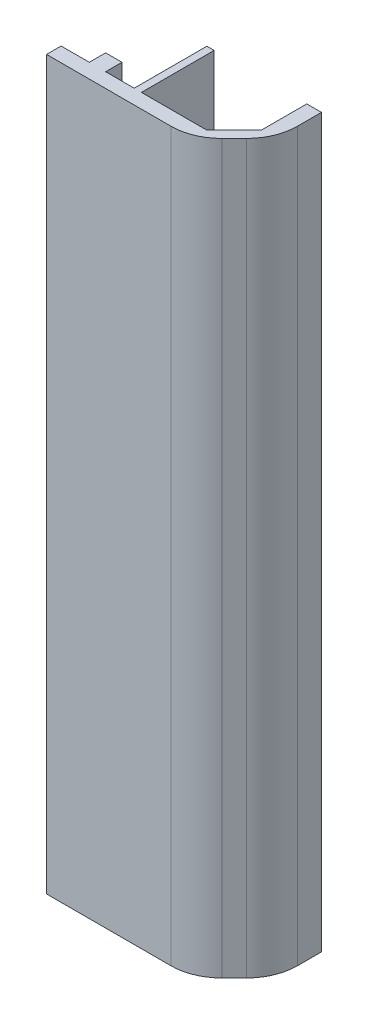
ISO-10303-21;
HEADER;
FILE_DESCRIPTION(('STEP AP214'),'2;1');
FILE_NAME('part.step','',(''),(''),'','','');
FILE_SCHEMA(('AUTOMOTIVE_DESIGN { 1 0 10303 214 1 1 1 1 }'));
ENDSEC;
DATA;
#1=APPLICATION_CONTEXT('core data for automotive mechanical design processes');
#2=APPLICATION_PROTOCOL_DEFINITION('international standard','automotive_design',2000,#1);
#3=PRODUCT_CONTEXT('',#1,'mechanical');
#4=PRODUCT('Part','Part','',(#3));
#5=PRODUCT_RELATED_PRODUCT_CATEGORY('part','',(#4));
#6=PRODUCT_DEFINITION_FORMATION('','',#4);
#7=PRODUCT_DEFINITION_CONTEXT('part definition',#1,'design');
#8=PRODUCT_DEFINITION('design','',#6,#7);
#9=PRODUCT_DEFINITION_SHAPE('','',#8);
#10=(LENGTH_UNIT() NAMED_UNIT(*) SI_UNIT(.MILLI.,.METRE.));
#11=(NAMED_UNIT(*) PLANE_ANGLE_UNIT() SI_UNIT($,.RADIAN.));
#12=(NAMED_UNIT(*) SI_UNIT($,.STERADIAN.) SOLID_ANGLE_UNIT());
#13=UNCERTAINTY_MEASURE_WITH_UNIT(LENGTH_MEASURE(1.E-05),#10,'distance_accuracy_value','');
#14=(GEOMETRIC_REPRESENTATION_CONTEXT(3) GLOBAL_UNCERTAINTY_ASSIGNED_CONTEXT((#13)) GLOBAL_UNIT_ASSIGNED_CONTEXT((#10,
#11,#12)) REPRESENTATION_CONTEXT('',''));
#15=CARTESIAN_POINT('',(0.,0.,0.));
#16=DIRECTION('',(0.,0.,1.));
#17=DIRECTION('',(1.,0.,0.));
#18=AXIS2_PLACEMENT_3D('',#15,#16,#17);
#19=CARTESIAN_POINT('',(-23.0017231924407,200.,-2.35925925925926));
#20=DIRECTION('',(0.,0.,1.));
#21=DIRECTION('',(1.,0.,0.));
#22=AXIS2_PLACEMENT_3D('',#19,#20,#21);
#23=PLANE('',#22);
#24=DIRECTION('',(0.,-1.,0.));
#25=VECTOR('',#24,1.);
#26=CARTESIAN_POINT('',(-13.1517231924407,200.,-2.35925925925926));
#27=LINE('',#26,#25);
#28=CARTESIAN_POINT('',(-13.1517231924407,200.,-2.35925925925926));
#29=VERTEX_POINT('',#28);
#30=CARTESIAN_POINT('',(-13.1517231924407,0.,-2.35925925925926));
#31=VERTEX_POINT('',#30);
#32=EDGE_CURVE('E59',#29,#31,#27,.T.);
#33=ORIENTED_EDGE('',*,*,#32,.F.);
#34=DIRECTION('',(-1.,0.,0.));
#35=VECTOR('',#34,1.);
#36=CARTESIAN_POINT('',(-23.0017231924407,200.,-2.35925925925926));
#37=LINE('',#36,#35);
#38=CARTESIAN_POINT('',(4.74827680755932,200.,-2.35925925925926));
#39=VERTEX_POINT('',#38);
#40=EDGE_CURVE('E218',#39,#29,#37,.T.);
#41=ORIENTED_EDGE('',*,*,#40,.F.);
#42=DIRECTION('',(0.,-1.,0.));
#43=VECTOR('',#42,1.);
#44=CARTESIAN_POINT('',(4.74827680755932,200.,-2.35925925925926));
#45=LINE('',#44,#43);
#46=CARTESIAN_POINT('',(4.74827680755932,0.,-2.35925925925926));
#47=VERTEX_POINT('',#46);
#48=EDGE_CURVE('E256',#39,#47,#45,.T.);
#49=ORIENTED_EDGE('',*,*,#48,.T.);
#50=DIRECTION('',(-1.,0.,0.));
#51=VECTOR('',#50,1.);
#52=CARTESIAN_POINT('',(-23.0017231924407,0.,-2.35925925925926));
#53=LINE('',#52,#51);
#54=EDGE_CURVE('E243',#47,#31,#53,.T.);
#55=ORIENTED_EDGE('',*,*,#54,.T.);
#56=EDGE_LOOP('',(#33,#41,#49,#55));
#57=FACE_BOUND('',#56,.T.);
#58=ADVANCED_FACE('F36',(#57),#23,.F.);
#59=DIRECTION('',(0.,1.,0.));
#60=VECTOR('',#59,1.);
#61=CARTESIAN_POINT('',(-15.1517231924407,200.,-2.35925925925926));
#62=LINE('',#61,#60);
#63=CARTESIAN_POINT('',(-15.1517231924407,0.,-2.35925925925926));
#64=VERTEX_POINT('',#63);
#65=CARTESIAN_POINT('',(-15.1517231924407,200.,-2.35925925925926));
#66=VERTEX_POINT('',#65);
#67=EDGE_CURVE('E184',#64,#66,#62,.T.);
#68=ORIENTED_EDGE('',*,*,#67,.F.);
#69=CARTESIAN_POINT('',(-23.0017231924407,0.,-2.35925925925926));
#70=VERTEX_POINT('',#69);
#71=EDGE_CURVE('E242',#64,#70,#53,.T.);
#72=ORIENTED_EDGE('',*,*,#71,.T.);
#73=DIRECTION('',(0.,-1.,0.));
#74=VECTOR('',#73,1.);
#75=CARTESIAN_POINT('',(-23.0017231924407,200.,-2.35925925925926));
#76=LINE('',#75,#74);
#77=CARTESIAN_POINT('',(-23.0017231924407,200.,-2.35925925925926));
#78=VERTEX_POINT('',#77);
#79=EDGE_CURVE('E253',#78,#70,#76,.T.);
#80=ORIENTED_EDGE('',*,*,#79,.F.);
#81=EDGE_CURVE('E51',#66,#78,#37,.T.);
#82=ORIENTED_EDGE('',*,*,#81,.F.);
#83=EDGE_LOOP('',(#68,#72,#80,#82));
#84=FACE_BOUND('',#83,.T.);
#85=ADVANCED_FACE('F328',(#84),#23,.F.);
#86=CARTESIAN_POINT('',(-27.5017231924407,200.,-6.85925925925926));
#87=DIRECTION('',(1.,0.,0.));
#88=DIRECTION('',(0.,0.,-1.));
#89=AXIS2_PLACEMENT_3D('',#86,#87,#88);
#90=PLANE('',#89);
#91=DIRECTION('',(0.,0.,1.));
#92=VECTOR('',#91,1.);
#93=CARTESIAN_POINT('',(-27.5017231924407,0.,-6.85925925925926));
#94=LINE('',#93,#92);
#95=CARTESIAN_POINT('',(-27.5017231924407,0.,-6.85925925925926));
#96=VERTEX_POINT('',#95);
#97=CARTESIAN_POINT('',(-27.5017231924407,0.,-2.35925925925926));
#98=VERTEX_POINT('',#97);
#99=EDGE_CURVE('E187',#96,#98,#94,.T.);
#100=ORIENTED_EDGE('',*,*,#99,.T.);
#101=DIRECTION('',(0.,-1.,0.));
#102=VECTOR('',#101,1.);
#103=CARTESIAN_POINT('',(-27.5017231924407,200.,-2.35925925925926));
#104=LINE('',#103,#102);
#105=CARTESIAN_POINT('',(-27.5017231924407,200.,-2.35925925925926));
#106=VERTEX_POINT('',#105);
#107=EDGE_CURVE('E274',#106,#98,#104,.T.);
#108=ORIENTED_EDGE('',*,*,#107,.F.);
#109=DIRECTION('',(0.,0.,1.));
#110=VECTOR('',#109,1.);
#111=CARTESIAN_POINT('',(-27.5017231924407,200.,-6.85925925925926));
#112=LINE('',#111,#110);
#113=CARTESIAN_POINT('',(-27.5017231924407,200.,-6.85925925925926));
#114=VERTEX_POINT('',#113);
#115=EDGE_CURVE('E196',#114,#106,#112,.T.);
#116=ORIENTED_EDGE('',*,*,#115,.F.);
#117=DIRECTION('',(0.,-1.,0.));
#118=VECTOR('',#117,1.);
#119=CARTESIAN_POINT('',(-27.5017231924407,200.,-6.85925925925926));
#120=LINE('',#119,#118);
#121=EDGE_CURVE('E223',#114,#96,#120,.T.);
#122=ORIENTED_EDGE('',*,*,#121,.T.);
#123=EDGE_LOOP('',(#100,#108,#116,#122));
#124=FACE_BOUND('',#123,.T.);
#125=ADVANCED_FACE('F318',(#124),#90,.F.);
#126=CARTESIAN_POINT('',(-27.5017231924407,200.,-2.35925925925926));
#127=DIRECTION('',(0.,0.,1.));
#128=DIRECTION('',(1.,0.,0.));
#129=AXIS2_PLACEMENT_3D('',#126,#127,#128);
#130=PLANE('',#129);
#131=DIRECTION('',(-1.,0.,0.));
#132=VECTOR('',#131,1.);
#133=CARTESIAN_POINT('',(-27.5017231924407,0.,-2.35925925925926));
#134=LINE('',#133,#132);
#135=CARTESIAN_POINT('',(-35.2517231924407,0.,-2.35925925925926));
#136=VERTEX_POINT('',#135);
#137=EDGE_CURVE('E190',#98,#136,#134,.T.);
#138=ORIENTED_EDGE('',*,*,#137,.T.);
#139=DIRECTION('',(0.,-1.,0.));
#140=VECTOR('',#139,1.);
#141=CARTESIAN_POINT('',(-35.2517231924407,200.,-2.35925925925926));
#142=LINE('',#141,#140);
#143=CARTESIAN_POINT('',(-35.2517231924407,200.,-2.35925925925926));
#144=VERTEX_POINT('',#143);
#145=EDGE_CURVE('E271',#144,#136,#142,.T.);
#146=ORIENTED_EDGE('',*,*,#145,.F.);
#147=DIRECTION('',(-1.,0.,0.));
#148=VECTOR('',#147,1.);
#149=CARTESIAN_POINT('',(-27.5017231924407,200.,-2.35925925925926));
#150=LINE('',#149,#148);
#151=EDGE_CURVE('E199',#106,#144,#150,.T.);
#152=ORIENTED_EDGE('',*,*,#151,.F.);
#153=ORIENTED_EDGE('',*,*,#107,.T.);
#154=EDGE_LOOP('',(#138,#146,#152,#153));
#155=FACE_BOUND('',#154,.T.);
#156=ADVANCED_FACE('F315',(#155),#130,.F.);
#157=CARTESIAN_POINT('',(-35.2517231924407,200.,-2.35925925925926));
#158=DIRECTION('',(1.,0.,0.));
#159=DIRECTION('',(0.,0.,-1.));
#160=AXIS2_PLACEMENT_3D('',#157,#158,#159);
#161=PLANE('',#160);
#162=DIRECTION('',(0.,0.,1.));
#163=VECTOR('',#162,1.);
#164=CARTESIAN_POINT('',(-35.2517231924407,0.,-2.35925925925926));
#165=LINE('',#164,#163);
#166=CARTESIAN_POINT('',(-35.2517231924407,0.,1.64074074074074));
#167=VERTEX_POINT('',#166);
#168=EDGE_CURVE('E226',#136,#167,#165,.T.);
#169=ORIENTED_EDGE('',*,*,#168,.T.);
#170=DIRECTION('',(0.,-1.,0.));
#171=VECTOR('',#170,1.);
#172=CARTESIAN_POINT('',(-35.2517231924407,200.,1.64074074074074));
#173=LINE('',#172,#171);
#174=CARTESIAN_POINT('',(-35.2517231924407,200.,1.64074074074074));
#175=VERTEX_POINT('',#174);
#176=EDGE_CURVE('E268',#175,#167,#173,.T.);
#177=ORIENTED_EDGE('',*,*,#176,.F.);
#178=DIRECTION('',(0.,0.,1.));
#179=VECTOR('',#178,1.);
#180=CARTESIAN_POINT('',(-35.2517231924407,200.,-2.35925925925926));
#181=LINE('',#180,#179);
#182=EDGE_CURVE('E202',#144,#175,#181,.T.);
#183=ORIENTED_EDGE('',*,*,#182,.F.);
#184=ORIENTED_EDGE('',*,*,#145,.T.);
#185=EDGE_LOOP('',(#169,#177,#183,#184));
#186=FACE_BOUND('',#185,.T.);
#187=ADVANCED_FACE('F309',(#186),#161,.F.);
#188=CARTESIAN_POINT('',(-35.2517231924407,200.,1.64074074074074));
#189=DIRECTION('',(0.,0.,-1.));
#190=DIRECTION('',(-1.,0.,0.));
#191=AXIS2_PLACEMENT_3D('',#188,#189,#190);
#192=PLANE('',#191);
#193=DIRECTION('',(1.,0.,0.));
#194=VECTOR('',#193,1.);
#195=CARTESIAN_POINT('',(-35.2517231924407,0.,1.64074074074074));
#196=LINE('',#195,#194);
#197=CARTESIAN_POINT('',(-1.02071306566402,0.,1.64074074074074));
#198=VERTEX_POINT('',#197);
#199=EDGE_CURVE('E228',#167,#198,#196,.T.);
#200=ORIENTED_EDGE('',*,*,#199,.T.);
#201=DIRECTION('',(0.,-1.,0.));
#202=VECTOR('',#201,1.);
#203=CARTESIAN_POINT('',(-1.02071306566402,200.,1.64074074074074));
#204=LINE('',#203,#202);
#205=CARTESIAN_POINT('',(-1.02071306566402,200.,1.64074074074074));
#206=VERTEX_POINT('',#205);
#207=EDGE_CURVE('E286',#198,#206,#204,.F.);
#208=ORIENTED_EDGE('',*,*,#207,.T.);
#209=DIRECTION('',(1.,0.,0.));
#210=VECTOR('',#209,1.);
#211=CARTESIAN_POINT('',(-35.2517231924407,200.,1.64074074074074));
#212=LINE('',#211,#210);
#213=EDGE_CURVE('E204',#175,#206,#212,.T.);
#214=ORIENTED_EDGE('',*,*,#213,.F.);
#215=ORIENTED_EDGE('',*,*,#176,.T.);
#216=EDGE_LOOP('',(#200,#208,#214,#215));
#217=FACE_BOUND('',#216,.T.);
#218=ADVANCED_FACE('F305',(#217),#192,.F.);
#219=CARTESIAN_POINT('',(4.77827680755932,200.,1.64074074074074));
#220=DIRECTION('',(-0.707106781186547,0.,-0.707106781186548));
#221=DIRECTION('',(-0.707106781186548,0.,0.707106781186547));
#222=AXIS2_PLACEMENT_3D('',#219,#220,#221);
#223=PLANE('',#222);
#224=DIRECTION('',(0.707106781186548,0.,-0.707106781186547));
#225=VECTOR('',#224,1.);
#226=CARTESIAN_POINT('',(4.77827680755932,200.,1.64074074074074));
#227=LINE('',#226,#225);
#228=CARTESIAN_POINT('',(8.87878187094765,200.,-2.45976432264759));
#229=VERTEX_POINT('',#228);
#230=CARTESIAN_POINT('',(12.2611050775043,200.,-5.84208752920422));
#231=VERTEX_POINT('',#230);
#232=EDGE_CURVE('E207',#229,#231,#227,.T.);
#233=ORIENTED_EDGE('',*,*,#232,.F.);
#234=DIRECTION('',(0.,-1.,0.));
#235=VECTOR('',#234,1.);
#236=CARTESIAN_POINT('',(8.87878187094765,200.,-2.45976432264759));
#237=LINE('',#236,#235);
#238=CARTESIAN_POINT('',(8.87878187094765,0.,-2.45976432264759));
#239=VERTEX_POINT('',#238);
#240=EDGE_CURVE('E279',#229,#239,#237,.T.);
#241=ORIENTED_EDGE('',*,*,#240,.T.);
#242=DIRECTION('',(0.707106781186548,0.,-0.707106781186547));
#243=VECTOR('',#242,1.);
#244=CARTESIAN_POINT('',(4.77827680755932,0.,1.64074074074074));
#245=LINE('',#244,#243);
#246=CARTESIAN_POINT('',(12.2611050775043,0.,-5.84208752920422));
#247=VERTEX_POINT('',#246);
#248=EDGE_CURVE('E231',#239,#247,#245,.T.);
#249=ORIENTED_EDGE('',*,*,#248,.T.);
#250=DIRECTION('',(0.,-1.,0.));
#251=VECTOR('',#250,1.);
#252=CARTESIAN_POINT('',(12.2611050775043,200.,-5.84208752920422));
#253=LINE('',#252,#251);
#254=EDGE_CURVE('E277',#247,#231,#253,.F.);
#255=ORIENTED_EDGE('',*,*,#254,.T.);
#256=EDGE_LOOP('',(#233,#241,#249,#255));
#257=FACE_BOUND('',#256,.T.);
#258=ADVANCED_FACE('F299',(#257),#223,.F.);
#259=CARTESIAN_POINT('',(16.3616101408926,200.,-22.3592592592593));
#260=DIRECTION('',(-1.,0.,0.));
#261=DIRECTION('',(0.,0.,1.));
#262=AXIS2_PLACEMENT_3D('',#259,#260,#261);
#263=PLANE('',#262);
#264=DIRECTION('',(0.,0.,-1.));
#265=VECTOR('',#264,1.);
#266=CARTESIAN_POINT('',(16.3616101408926,200.,-22.3592592592593));
#267=LINE('',#266,#265);
#268=CARTESIAN_POINT('',(16.3616101408926,200.,-15.7415824658159));
#269=VERTEX_POINT('',#268);
#270=CARTESIAN_POINT('',(16.3616101408926,200.,-22.3592592592593));
#271=VERTEX_POINT('',#270);
#272=EDGE_CURVE('E210',#269,#271,#267,.T.);
#273=ORIENTED_EDGE('',*,*,#272,.F.);
#274=DIRECTION('',(0.,-1.,0.));
#275=VECTOR('',#274,1.);
#276=CARTESIAN_POINT('',(16.3616101408926,200.,-15.7415824658159));
#277=LINE('',#276,#275);
#278=CARTESIAN_POINT('',(16.3616101408926,0.,-15.7415824658159));
#279=VERTEX_POINT('',#278);
#280=EDGE_CURVE('E11',#269,#279,#277,.T.);
#281=ORIENTED_EDGE('',*,*,#280,.T.);
#282=DIRECTION('',(0.,0.,-1.));
#283=VECTOR('',#282,1.);
#284=CARTESIAN_POINT('',(16.3616101408926,0.,-22.3592592592593));
#285=LINE('',#284,#283);
#286=CARTESIAN_POINT('',(16.3616101408926,0.,-22.3592592592593));
#287=VERTEX_POINT('',#286);
#288=EDGE_CURVE('E234',#279,#287,#285,.T.);
#289=ORIENTED_EDGE('',*,*,#288,.T.);
#290=DIRECTION('',(0.,-1.,0.));
#291=VECTOR('',#290,1.);
#292=CARTESIAN_POINT('',(16.3616101408926,200.,-22.3592592592593));
#293=LINE('',#292,#291);
#294=EDGE_CURVE('E265',#271,#287,#293,.T.);
#295=ORIENTED_EDGE('',*,*,#294,.F.);
#296=EDGE_LOOP('',(#273,#281,#289,#295));
#297=FACE_BOUND('',#296,.T.);
#298=ADVANCED_FACE('F358',(#297),#263,.F.);
#299=CARTESIAN_POINT('',(12.3316101408926,200.,-22.3592592592593));
#300=DIRECTION('',(0.,0.,1.));
#301=DIRECTION('',(1.,0.,0.));
#302=AXIS2_PLACEMENT_3D('',#299,#300,#301);
#303=PLANE('',#302);
#304=DIRECTION('',(-1.,0.,0.));
#305=VECTOR('',#304,1.);
#306=CARTESIAN_POINT('',(12.3316101408926,0.,-22.3592592592593));
#307=LINE('',#306,#305);
#308=CARTESIAN_POINT('',(12.3316101408926,0.,-22.3592592592593));
#309=VERTEX_POINT('',#308);
#310=EDGE_CURVE('E236',#287,#309,#307,.T.);
#311=ORIENTED_EDGE('',*,*,#310,.T.);
#312=DIRECTION('',(0.,-1.,0.));
#313=VECTOR('',#312,1.);
#314=CARTESIAN_POINT('',(12.3316101408926,200.,-22.3592592592593));
#315=LINE('',#314,#313);
#316=CARTESIAN_POINT('',(12.3316101408926,200.,-22.3592592592593));
#317=VERTEX_POINT('',#316);
#318=EDGE_CURVE('E262',#317,#309,#315,.T.);
#319=ORIENTED_EDGE('',*,*,#318,.F.);
#320=DIRECTION('',(-1.,0.,0.));
#321=VECTOR('',#320,1.);
#322=CARTESIAN_POINT('',(12.3316101408926,200.,-22.3592592592593));
#323=LINE('',#322,#321);
#324=EDGE_CURVE('E212',#271,#317,#323,.T.);
#325=ORIENTED_EDGE('',*,*,#324,.F.);
#326=ORIENTED_EDGE('',*,*,#294,.T.);
#327=EDGE_LOOP('',(#311,#319,#325,#326));
#328=FACE_BOUND('',#327,.T.);
#329=ADVANCED_FACE('F353',(#328),#303,.F.);
#330=CARTESIAN_POINT('',(12.3316101408926,200.,-9.94259259259255));
#331=DIRECTION('',(1.,0.,0.));
#332=DIRECTION('',(0.,0.,-1.));
#333=AXIS2_PLACEMENT_3D('',#330,#331,#332);
#334=PLANE('',#333);
#335=DIRECTION('',(0.,0.,1.));
#336=VECTOR('',#335,1.);
#337=CARTESIAN_POINT('',(12.3316101408926,0.,-9.94259259259255));
#338=LINE('',#337,#336);
#339=CARTESIAN_POINT('',(12.3316101408926,0.,-9.94259259259255));
#340=VERTEX_POINT('',#339);
#341=EDGE_CURVE('E238',#309,#340,#338,.T.);
#342=ORIENTED_EDGE('',*,*,#341,.T.);
#343=DIRECTION('',(0.,-1.,0.));
#344=VECTOR('',#343,1.);
#345=CARTESIAN_POINT('',(12.3316101408926,200.,-9.94259259259255));
#346=LINE('',#345,#344);
#347=CARTESIAN_POINT('',(12.3316101408926,200.,-9.94259259259255));
#348=VERTEX_POINT('',#347);
#349=EDGE_CURVE('E259',#348,#340,#346,.T.);
#350=ORIENTED_EDGE('',*,*,#349,.F.);
#351=DIRECTION('',(0.,0.,1.));
#352=VECTOR('',#351,1.);
#353=CARTESIAN_POINT('',(12.3316101408926,200.,-9.94259259259255));
#354=LINE('',#353,#352);
#355=EDGE_CURVE('E214',#317,#348,#354,.T.);
#356=ORIENTED_EDGE('',*,*,#355,.F.);
#357=ORIENTED_EDGE('',*,*,#318,.T.);
#358=EDGE_LOOP('',(#342,#350,#356,#357));
#359=FACE_BOUND('',#358,.T.);
#360=ADVANCED_FACE('F349',(#359),#334,.F.);
#361=CARTESIAN_POINT('',(4.74827680755932,200.,-2.35925925925926));
#362=DIRECTION('',(0.707106781186548,0.,0.707106781186547));
#363=DIRECTION('',(0.707106781186547,0.,-0.707106781186548));
#364=AXIS2_PLACEMENT_3D('',#361,#362,#363);
#365=PLANE('',#364);
#366=DIRECTION('',(-0.707106781186547,0.,0.707106781186548));
#367=VECTOR('',#366,1.);
#368=CARTESIAN_POINT('',(4.74827680755932,0.,-2.35925925925926));
#369=LINE('',#368,#367);
#370=EDGE_CURVE('E240',#340,#47,#369,.T.);
#371=ORIENTED_EDGE('',*,*,#370,.T.);
#372=ORIENTED_EDGE('',*,*,#48,.F.);
#373=DIRECTION('',(-0.707106781186547,0.,0.707106781186548));
#374=VECTOR('',#373,1.);
#375=CARTESIAN_POINT('',(4.74827680755932,200.,-2.35925925925926));
#376=LINE('',#375,#374);
#377=EDGE_CURVE('E216',#348,#39,#376,.T.);
#378=ORIENTED_EDGE('',*,*,#377,.F.);
#379=ORIENTED_EDGE('',*,*,#349,.T.);
#380=EDGE_LOOP('',(#371,#372,#378,#379));
#381=FACE_BOUND('',#380,.T.);
#382=ADVANCED_FACE('F345',(#381),#365,.F.);
#383=CARTESIAN_POINT('',(-23.0017231924407,200.,-6.85925925925926));
#384=DIRECTION('',(-1.,0.,0.));
#385=DIRECTION('',(0.,0.,1.));
#386=AXIS2_PLACEMENT_3D('',#383,#384,#385);
#387=PLANE('',#386);
#388=DIRECTION('',(0.,0.,-1.));
#389=VECTOR('',#388,1.);
#390=CARTESIAN_POINT('',(-23.0017231924407,0.,-6.85925925925926));
#391=LINE('',#390,#389);
#392=CARTESIAN_POINT('',(-23.0017231924407,0.,-6.85925925925926));
#393=VERTEX_POINT('',#392);
#394=EDGE_CURVE('E245',#70,#393,#391,.T.);
#395=ORIENTED_EDGE('',*,*,#394,.T.);
#396=DIRECTION('',(0.,-1.,0.));
#397=VECTOR('',#396,1.);
#398=CARTESIAN_POINT('',(-23.0017231924407,200.,-6.85925925925926));
#399=LINE('',#398,#397);
#400=CARTESIAN_POINT('',(-23.0017231924407,200.,-6.85925925925926));
#401=VERTEX_POINT('',#400);
#402=EDGE_CURVE('E250',#401,#393,#399,.T.);
#403=ORIENTED_EDGE('',*,*,#402,.F.);
#404=DIRECTION('',(0.,0.,-1.));
#405=VECTOR('',#404,1.);
#406=CARTESIAN_POINT('',(-23.0017231924407,200.,-6.85925925925926));
#407=LINE('',#406,#405);
#408=EDGE_CURVE('E220',#78,#401,#407,.T.);
#409=ORIENTED_EDGE('',*,*,#408,.F.);
#410=ORIENTED_EDGE('',*,*,#79,.T.);
#411=EDGE_LOOP('',(#395,#403,#409,#410));
#412=FACE_BOUND('',#411,.T.);
#413=ADVANCED_FACE('F326',(#412),#387,.F.);
#414=CARTESIAN_POINT('',(-27.5017231924407,200.,-6.85925925925926));
#415=DIRECTION('',(0.,0.,1.));
#416=DIRECTION('',(1.,0.,0.));
#417=AXIS2_PLACEMENT_3D('',#414,#415,#416);
#418=PLANE('',#417);
#419=DIRECTION('',(-1.,0.,0.));
#420=VECTOR('',#419,1.);
#421=CARTESIAN_POINT('',(-27.5017231924407,0.,-6.85925925925926));
#422=LINE('',#421,#420);
#423=EDGE_CURVE('E200',#393,#96,#422,.T.);
#424=ORIENTED_EDGE('',*,*,#423,.T.);
#425=ORIENTED_EDGE('',*,*,#121,.F.);
#426=DIRECTION('',(-1.,0.,0.));
#427=VECTOR('',#426,1.);
#428=CARTESIAN_POINT('',(-27.5017231924407,200.,-6.85925925925926));
#429=LINE('',#428,#427);
#430=EDGE_CURVE('E222',#401,#114,#429,.T.);
#431=ORIENTED_EDGE('',*,*,#430,.F.);
#432=ORIENTED_EDGE('',*,*,#402,.T.);
#433=EDGE_LOOP('',(#424,#425,#431,#432));
#434=FACE_BOUND('',#433,.T.);
#435=ADVANCED_FACE('F322',(#434),#418,.F.);
#436=CARTESIAN_POINT('',(0.,200.,0.));
#437=DIRECTION('',(0.,-1.,0.));
#438=DIRECTION('',(0.,0.,-1.));
#439=AXIS2_PLACEMENT_3D('',#436,#437,#438);
#440=PLANE('',#439);
#441=ORIENTED_EDGE('',*,*,#213,.T.);
#442=CARTESIAN_POINT('',(-1.02071306566402,200.,-12.3592592592593));
#443=DIRECTION('',(0.,-1.,0.));
#444=DIRECTION('',(0.,0.,-1.));
#445=AXIS2_PLACEMENT_3D('',#442,#443,#444);
#446=CIRCLE('',#445,14.);
#447=EDGE_CURVE('E44',#206,#229,#446,.F.);
#448=ORIENTED_EDGE('',*,*,#447,.T.);
#449=ORIENTED_EDGE('',*,*,#232,.T.);
#450=CARTESIAN_POINT('',(2.36161014089262,200.,-15.7415824658159));
#451=DIRECTION('',(0.,-1.,0.));
#452=DIRECTION('',(0.,0.,-1.));
#453=AXIS2_PLACEMENT_3D('',#450,#451,#452);
#454=CIRCLE('',#453,14.);
#455=EDGE_CURVE('E288',#231,#269,#454,.F.);
#456=ORIENTED_EDGE('',*,*,#455,.T.);
#457=ORIENTED_EDGE('',*,*,#272,.T.);
#458=ORIENTED_EDGE('',*,*,#324,.T.);
#459=ORIENTED_EDGE('',*,*,#355,.T.);
#460=ORIENTED_EDGE('',*,*,#377,.T.);
#461=ORIENTED_EDGE('',*,*,#40,.T.);
#462=DIRECTION('',(0.,0.,1.));
#463=VECTOR('',#462,1.);
#464=CARTESIAN_POINT('',(-13.1517231924407,200.,-22.3592592592593));
#465=LINE('',#464,#463);
#466=CARTESIAN_POINT('',(-13.1517231924407,200.,-22.3592592592593));
#467=VERTEX_POINT('',#466);
#468=EDGE_CURVE('E335',#467,#29,#465,.T.);
#469=ORIENTED_EDGE('',*,*,#468,.F.);
#470=DIRECTION('',(1.,0.,0.));
#471=VECTOR('',#470,1.);
#472=CARTESIAN_POINT('',(-13.1517231924407,200.,-22.3592592592593));
#473=LINE('',#472,#471);
#474=CARTESIAN_POINT('',(-15.1517231924407,200.,-22.3592592592593));
#475=VERTEX_POINT('',#474);
#476=EDGE_CURVE('E180',#475,#467,#473,.T.);
#477=ORIENTED_EDGE('',*,*,#476,.F.);
#478=DIRECTION('',(0.,0.,1.));
#479=VECTOR('',#478,1.);
#480=CARTESIAN_POINT('',(-15.1517231924407,200.,-22.3592592592593));
#481=LINE('',#480,#479);
#482=EDGE_CURVE('E192',#475,#66,#481,.T.);
#483=ORIENTED_EDGE('',*,*,#482,.T.);
#484=ORIENTED_EDGE('',*,*,#81,.T.);
#485=ORIENTED_EDGE('',*,*,#408,.T.);
#486=ORIENTED_EDGE('',*,*,#430,.T.);
#487=ORIENTED_EDGE('',*,*,#115,.T.);
#488=ORIENTED_EDGE('',*,*,#151,.T.);
#489=ORIENTED_EDGE('',*,*,#182,.T.);
#490=EDGE_LOOP('',(#441,#448,#449,#456,#457,#458,#459,#460,#461,#469,#477,#483,#484,#485,#486,
#487,#488,#489));
#491=FACE_BOUND('',#490,.T.);
#492=ADVANCED_FACE('F292',(#491),#440,.F.);
#493=CARTESIAN_POINT('',(0.,0.,0.));
#494=DIRECTION('',(0.,-1.,0.));
#495=DIRECTION('',(0.,0.,-1.));
#496=AXIS2_PLACEMENT_3D('',#493,#494,#495);
#497=PLANE('',#496);
#498=ORIENTED_EDGE('',*,*,#248,.F.);
#499=CARTESIAN_POINT('',(-1.02071306566402,0.,-12.3592592592593));
#500=DIRECTION('',(0.,-1.,0.));
#501=DIRECTION('',(0.,0.,-1.));
#502=AXIS2_PLACEMENT_3D('',#499,#500,#501);
#503=CIRCLE('',#502,14.);
#504=EDGE_CURVE('E284',#239,#198,#503,.T.);
#505=ORIENTED_EDGE('',*,*,#504,.T.);
#506=ORIENTED_EDGE('',*,*,#199,.F.);
#507=ORIENTED_EDGE('',*,*,#168,.F.);
#508=ORIENTED_EDGE('',*,*,#137,.F.);
#509=ORIENTED_EDGE('',*,*,#99,.F.);
#510=ORIENTED_EDGE('',*,*,#423,.F.);
#511=ORIENTED_EDGE('',*,*,#394,.F.);
#512=ORIENTED_EDGE('',*,*,#71,.F.);
#513=DIRECTION('',(0.,0.,1.));
#514=VECTOR('',#513,1.);
#515=CARTESIAN_POINT('',(-15.1517231924407,0.,-22.3592592592593));
#516=LINE('',#515,#514);
#517=CARTESIAN_POINT('',(-15.1517231924407,0.,-22.3592592592593));
#518=VERTEX_POINT('',#517);
#519=EDGE_CURVE('E171',#518,#64,#516,.T.);
#520=ORIENTED_EDGE('',*,*,#519,.F.);
#521=DIRECTION('',(-1.,0.,0.));
#522=VECTOR('',#521,1.);
#523=CARTESIAN_POINT('',(-13.1517231924407,0.,-22.3592592592593));
#524=LINE('',#523,#522);
#525=CARTESIAN_POINT('',(-13.1517231924407,0.,-22.3592592592593));
#526=VERTEX_POINT('',#525);
#527=EDGE_CURVE('E163',#526,#518,#524,.T.);
#528=ORIENTED_EDGE('',*,*,#527,.F.);
#529=DIRECTION('',(0.,0.,1.));
#530=VECTOR('',#529,1.);
#531=CARTESIAN_POINT('',(-13.1517231924407,0.,-22.3592592592593));
#532=LINE('',#531,#530);
#533=EDGE_CURVE('E169',#526,#31,#532,.T.);
#534=ORIENTED_EDGE('',*,*,#533,.T.);
#535=ORIENTED_EDGE('',*,*,#54,.F.);
#536=ORIENTED_EDGE('',*,*,#370,.F.);
#537=ORIENTED_EDGE('',*,*,#341,.F.);
#538=ORIENTED_EDGE('',*,*,#310,.F.);
#539=ORIENTED_EDGE('',*,*,#288,.F.);
#540=CARTESIAN_POINT('',(2.36161014089262,0.,-15.7415824658159));
#541=DIRECTION('',(0.,-1.,0.));
#542=DIRECTION('',(0.,0.,-1.));
#543=AXIS2_PLACEMENT_3D('',#540,#541,#542);
#544=CIRCLE('',#543,14.);
#545=EDGE_CURVE('E282',#279,#247,#544,.T.);
#546=ORIENTED_EDGE('',*,*,#545,.T.);
#547=EDGE_LOOP('',(#498,#505,#506,#507,#508,#509,#510,#511,#512,#520,#528,#534,#535,#536,#537,
#538,#539,#546));
#548=FACE_BOUND('',#547,.T.);
#549=ADVANCED_FACE('F166',(#548),#497,.T.);
#550=CARTESIAN_POINT('',(-1.02071306566402,200.,-12.3592592592593));
#551=DIRECTION('',(0.,-1.,0.));
#552=DIRECTION('',(0.,0.,-1.));
#553=AXIS2_PLACEMENT_3D('',#550,#551,#552);
#554=CYLINDRICAL_SURFACE('',#553,14.);
#555=ORIENTED_EDGE('',*,*,#447,.F.);
#556=ORIENTED_EDGE('',*,*,#207,.F.);
#557=ORIENTED_EDGE('',*,*,#504,.F.);
#558=ORIENTED_EDGE('',*,*,#240,.F.);
#559=EDGE_LOOP('',(#555,#556,#557,#558));
#560=FACE_BOUND('',#559,.T.);
#561=ADVANCED_FACE('F301',(#560),#554,.T.);
#562=CARTESIAN_POINT('',(2.36161014089262,200.,-15.7415824658159));
#563=DIRECTION('',(0.,-1.,0.));
#564=DIRECTION('',(0.,0.,-1.));
#565=AXIS2_PLACEMENT_3D('',#562,#563,#564);
#566=CYLINDRICAL_SURFACE('',#565,14.);
#567=ORIENTED_EDGE('',*,*,#455,.F.);
#568=ORIENTED_EDGE('',*,*,#254,.F.);
#569=ORIENTED_EDGE('',*,*,#545,.F.);
#570=ORIENTED_EDGE('',*,*,#280,.F.);
#571=EDGE_LOOP('',(#567,#568,#569,#570));
#572=FACE_BOUND('',#571,.T.);
#573=ADVANCED_FACE('F38',(#572),#566,.T.);
#574=CARTESIAN_POINT('',(-13.1517231924407,200.,-22.3592592592593));
#575=DIRECTION('',(-1.,0.,0.));
#576=DIRECTION('',(0.,-1.,0.));
#577=AXIS2_PLACEMENT_3D('',#574,#575,#576);
#578=PLANE('',#577);
#579=ORIENTED_EDGE('',*,*,#32,.T.);
#580=ORIENTED_EDGE('',*,*,#533,.F.);
#581=DIRECTION('',(0.,-1.,0.));
#582=VECTOR('',#581,1.);
#583=CARTESIAN_POINT('',(-13.1517231924407,200.,-22.3592592592593));
#584=LINE('',#583,#582);
#585=EDGE_CURVE('E175',#467,#526,#584,.T.);
#586=ORIENTED_EDGE('',*,*,#585,.F.);
#587=ORIENTED_EDGE('',*,*,#468,.T.);
#588=EDGE_LOOP('',(#579,#580,#586,#587));
#589=FACE_BOUND('',#588,.T.);
#590=ADVANCED_FACE('F186',(#589),#578,.F.);
#591=CARTESIAN_POINT('',(-15.1517231924407,200.,-22.3592592592593));
#592=DIRECTION('',(1.,0.,0.));
#593=DIRECTION('',(0.,1.,0.));
#594=AXIS2_PLACEMENT_3D('',#591,#592,#593);
#595=PLANE('',#594);
#596=ORIENTED_EDGE('',*,*,#67,.T.);
#597=ORIENTED_EDGE('',*,*,#482,.F.);
#598=DIRECTION('',(0.,1.,0.));
#599=VECTOR('',#598,1.);
#600=CARTESIAN_POINT('',(-15.1517231924407,200.,-22.3592592592593));
#601=LINE('',#600,#599);
#602=EDGE_CURVE('E174',#518,#475,#601,.T.);
#603=ORIENTED_EDGE('',*,*,#602,.F.);
#604=ORIENTED_EDGE('',*,*,#519,.T.);
#605=EDGE_LOOP('',(#596,#597,#603,#604));
#606=FACE_BOUND('',#605,.T.);
#607=ADVANCED_FACE('F333',(#606),#595,.F.);
#608=CARTESIAN_POINT('',(0.,0.,-22.3592592592593));
#609=DIRECTION('',(0.,0.,-1.));
#610=DIRECTION('',(-1.,0.,0.));
#611=AXIS2_PLACEMENT_3D('',#608,#609,#610);
#612=PLANE('',#611);
#613=ORIENTED_EDGE('',*,*,#585,.T.);
#614=ORIENTED_EDGE('',*,*,#527,.T.);
#615=ORIENTED_EDGE('',*,*,#602,.T.);
#616=ORIENTED_EDGE('',*,*,#476,.T.);
#617=EDGE_LOOP('',(#613,#614,#615,#616));
#618=FACE_BOUND('',#617,.T.);
#619=ADVANCED_FACE('F178',(#618),#612,.T.);
#620=CLOSED_SHELL('',(#58,#85,#125,#156,#187,#218,#258,#298,#329,#360,#382,#413,#435,#492,#549,
#561,#573,#590,#607,#619));
#621=MANIFOLD_SOLID_BREP('B2',#620);
#622=ADVANCED_BREP_SHAPE_REPRESENTATION('',(#18,#621),#14);
#623=SHAPE_DEFINITION_REPRESENTATION(#9,#622);
ENDSEC;
END-ISO-10303-21;
